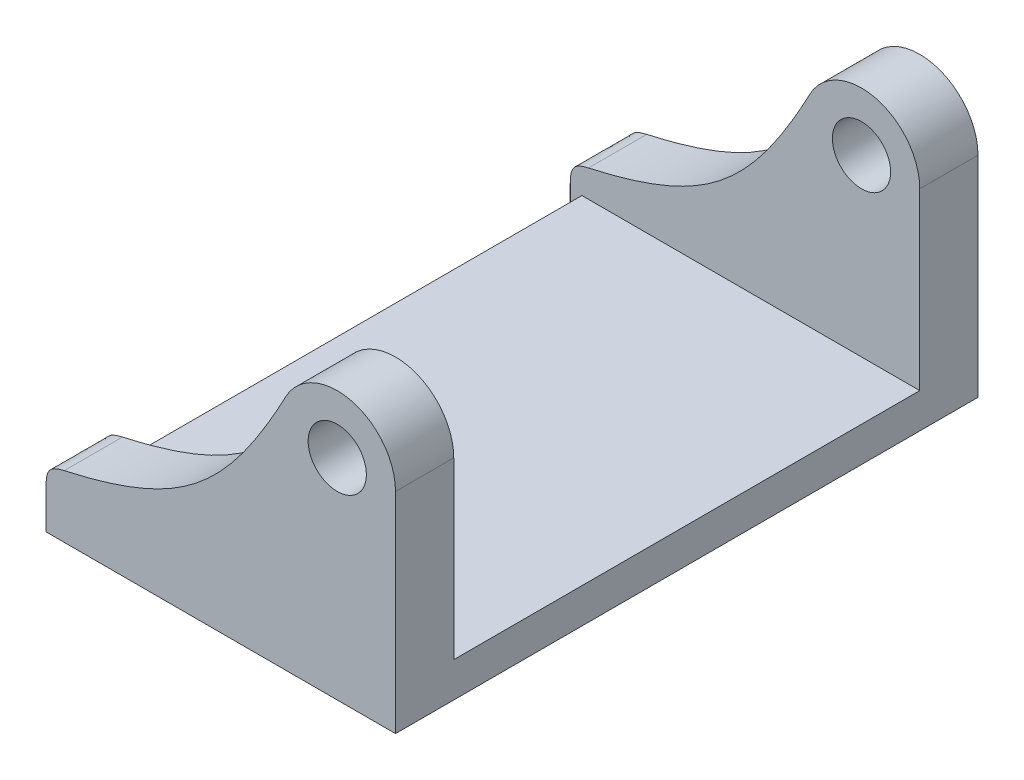
ISO-10303-21;
HEADER;
FILE_DESCRIPTION(('STEP AP214'),'2;1');
FILE_NAME('part.step','',(''),(''),'','','');
FILE_SCHEMA(('AUTOMOTIVE_DESIGN { 1 0 10303 214 1 1 1 1 }'));
ENDSEC;
DATA;
#1=APPLICATION_CONTEXT('core data for automotive mechanical design processes');
#2=APPLICATION_PROTOCOL_DEFINITION('international standard','automotive_design',2000,#1);
#3=PRODUCT_CONTEXT('',#1,'mechanical');
#4=PRODUCT('Part','Part','',(#3));
#5=PRODUCT_RELATED_PRODUCT_CATEGORY('part','',(#4));
#6=PRODUCT_DEFINITION_FORMATION('','',#4);
#7=PRODUCT_DEFINITION_CONTEXT('part definition',#1,'design');
#8=PRODUCT_DEFINITION('design','',#6,#7);
#9=PRODUCT_DEFINITION_SHAPE('','',#8);
#10=(LENGTH_UNIT() NAMED_UNIT(*) SI_UNIT(.MILLI.,.METRE.));
#11=(NAMED_UNIT(*) PLANE_ANGLE_UNIT() SI_UNIT($,.RADIAN.));
#12=(NAMED_UNIT(*) SI_UNIT($,.STERADIAN.) SOLID_ANGLE_UNIT());
#13=UNCERTAINTY_MEASURE_WITH_UNIT(LENGTH_MEASURE(1.E-05),#10,'distance_accuracy_value','');
#14=(GEOMETRIC_REPRESENTATION_CONTEXT(3) GLOBAL_UNCERTAINTY_ASSIGNED_CONTEXT((#13)) GLOBAL_UNIT_ASSIGNED_CONTEXT((#10,
#11,#12)) REPRESENTATION_CONTEXT('',''));
#15=CARTESIAN_POINT('',(0.,0.,0.));
#16=DIRECTION('',(0.,0.,1.));
#17=DIRECTION('',(1.,0.,0.));
#18=AXIS2_PLACEMENT_3D('',#15,#16,#17);
#19=CARTESIAN_POINT('',(0.,3.,0.));
#20=DIRECTION('',(0.,-1.,0.));
#21=DIRECTION('',(0.,0.,-1.));
#22=AXIS2_PLACEMENT_3D('',#19,#20,#21);
#23=PLANE('',#22);
#24=DIRECTION('',(-1.,0.,0.));
#25=VECTOR('',#24,1.);
#26=CARTESIAN_POINT('',(0.,3.,-20.));
#27=LINE('',#26,#25);
#28=CARTESIAN_POINT('',(15.,3.,-20.));
#29=VERTEX_POINT('',#28);
#30=CARTESIAN_POINT('',(-14.,3.,-20.));
#31=VERTEX_POINT('',#30);
#32=EDGE_CURVE('E162',#29,#31,#27,.T.);
#33=ORIENTED_EDGE('',*,*,#32,.T.);
#34=DIRECTION('',(0.,0.,1.));
#35=VECTOR('',#34,1.);
#36=CARTESIAN_POINT('',(-14.,3.,0.));
#37=LINE('',#36,#35);
#38=CARTESIAN_POINT('',(-14.,3.,20.));
#39=VERTEX_POINT('',#38);
#40=EDGE_CURVE('E535',#31,#39,#37,.T.);
#41=ORIENTED_EDGE('',*,*,#40,.T.);
#42=DIRECTION('',(-1.,0.,0.));
#43=VECTOR('',#42,1.);
#44=CARTESIAN_POINT('',(0.,3.,20.));
#45=LINE('',#44,#43);
#46=CARTESIAN_POINT('',(15.,3.,20.));
#47=VERTEX_POINT('',#46);
#48=EDGE_CURVE('E386',#47,#39,#45,.T.);
#49=ORIENTED_EDGE('',*,*,#48,.F.);
#50=DIRECTION('',(0.,0.,-1.));
#51=VECTOR('',#50,1.);
#52=CARTESIAN_POINT('',(15.,3.,25.));
#53=LINE('',#52,#51);
#54=EDGE_CURVE('E387',#47,#29,#53,.T.);
#55=ORIENTED_EDGE('',*,*,#54,.T.);
#56=EDGE_LOOP('',(#33,#41,#49,#55));
#57=FACE_BOUND('',#56,.T.);
#58=ADVANCED_FACE('F41',(#57),#23,.F.);
#59=CARTESIAN_POINT('',(15.,3.,25.));
#60=DIRECTION('',(-1.,0.,0.));
#61=DIRECTION('',(0.,0.,1.));
#62=AXIS2_PLACEMENT_3D('',#59,#60,#61);
#63=PLANE('',#62);
#64=DIRECTION('',(0.,0.,-1.));
#65=VECTOR('',#64,1.);
#66=CARTESIAN_POINT('',(15.,0.,25.));
#67=LINE('',#66,#65);
#68=CARTESIAN_POINT('',(15.,0.,25.));
#69=VERTEX_POINT('',#68);
#70=CARTESIAN_POINT('',(15.,0.,-25.));
#71=VERTEX_POINT('',#70);
#72=EDGE_CURVE('E385',#69,#71,#67,.T.);
#73=ORIENTED_EDGE('',*,*,#72,.T.);
#74=DIRECTION('',(0.,-1.,0.));
#75=VECTOR('',#74,1.);
#76=CARTESIAN_POINT('',(15.,3.,-25.));
#77=LINE('',#76,#75);
#78=CARTESIAN_POINT('',(15.,18.,-25.));
#79=VERTEX_POINT('',#78);
#80=EDGE_CURVE('E144',#79,#71,#77,.T.);
#81=ORIENTED_EDGE('',*,*,#80,.F.);
#82=DIRECTION('',(0.,0.,-1.));
#83=VECTOR('',#82,1.);
#84=CARTESIAN_POINT('',(15.,18.,-20.));
#85=LINE('',#84,#83);
#86=CARTESIAN_POINT('',(15.,18.,-20.));
#87=VERTEX_POINT('',#86);
#88=EDGE_CURVE('E136',#87,#79,#85,.T.);
#89=ORIENTED_EDGE('',*,*,#88,.F.);
#90=DIRECTION('',(0.,-1.,0.));
#91=VECTOR('',#90,1.);
#92=CARTESIAN_POINT('',(15.,0.,-20.));
#93=LINE('',#92,#91);
#94=EDGE_CURVE('E142',#87,#29,#93,.T.);
#95=ORIENTED_EDGE('',*,*,#94,.T.);
#96=ORIENTED_EDGE('',*,*,#54,.F.);
#97=DIRECTION('',(0.,-1.,0.));
#98=VECTOR('',#97,1.);
#99=CARTESIAN_POINT('',(15.,0.,20.));
#100=LINE('',#99,#98);
#101=CARTESIAN_POINT('',(15.,18.,20.));
#102=VERTEX_POINT('',#101);
#103=EDGE_CURVE('E509',#102,#47,#100,.T.);
#104=ORIENTED_EDGE('',*,*,#103,.F.);
#105=DIRECTION('',(0.,0.,1.));
#106=VECTOR('',#105,1.);
#107=CARTESIAN_POINT('',(15.,18.,20.));
#108=LINE('',#107,#106);
#109=CARTESIAN_POINT('',(15.,18.,25.));
#110=VERTEX_POINT('',#109);
#111=EDGE_CURVE('E382',#102,#110,#108,.T.);
#112=ORIENTED_EDGE('',*,*,#111,.T.);
#113=DIRECTION('',(0.,-1.,0.));
#114=VECTOR('',#113,1.);
#115=CARTESIAN_POINT('',(15.,3.,25.));
#116=LINE('',#115,#114);
#117=EDGE_CURVE('E370',#110,#69,#116,.T.);
#118=ORIENTED_EDGE('',*,*,#117,.T.);
#119=EDGE_LOOP('',(#73,#81,#89,#95,#96,#104,#112,#118));
#120=FACE_BOUND('',#119,.T.);
#121=ADVANCED_FACE('F139',(#120),#63,.F.);
#122=CARTESIAN_POINT('',(-15.,3.,-25.));
#123=DIRECTION('',(0.,0.,1.));
#124=DIRECTION('',(1.,0.,0.));
#125=AXIS2_PLACEMENT_3D('',#122,#123,#124);
#126=PLANE('',#125);
#127=DIRECTION('',(0.,-1.,0.));
#128=VECTOR('',#127,1.);
#129=CARTESIAN_POINT('',(-15.,3.,-25.));
#130=LINE('',#129,#128);
#131=CARTESIAN_POINT('',(-15.,3.37956727641906,-25.));
#132=VERTEX_POINT('',#131);
#133=CARTESIAN_POINT('',(-15.,0.,-25.));
#134=VERTEX_POINT('',#133);
#135=EDGE_CURVE('E362',#132,#134,#130,.T.);
#136=ORIENTED_EDGE('',*,*,#135,.F.);
#137=CARTESIAN_POINT('',(-13.4365365637369,5.33134488376153,-25.));
#138=CARTESIAN_POINT('',(-14.9999999999976,4.98165906226673,-25.));
#139=CARTESIAN_POINT('',(-15.,3.37956727641906,-25.));
#140=(BOUNDED_CURVE() B_SPLINE_CURVE(2,(#137,#138,#139),.UNSPECIFIED.,.F.,
.F.) B_SPLINE_CURVE_WITH_KNOTS((3,3),(0.,1.),
.UNSPECIFIED.) CURVE() GEOMETRIC_REPRESENTATION_ITEM() RATIONAL_B_SPLINE_CURVE((1.,1.5,1.)) REPRESENTATION_ITEM(''));
#141=CARTESIAN_POINT('',(-13.4365895277737,5.33157594025399,-25.));
#142=VERTEX_POINT('',#141);
#143=EDGE_CURVE('E407',#132,#142,#140,.F.);
#144=ORIENTED_EDGE('',*,*,#143,.T.);
#145=CARTESIAN_POINT('',(5.58373028161165,20.3444747331644,-25.));
#146=CARTESIAN_POINT('',(-1.07589230968556,7.79979290324144,-25.));
#147=CARTESIAN_POINT('',(-15.,5.,-25.));
#148=(BOUNDED_CURVE() B_SPLINE_CURVE(2,(#145,#146,#147),.UNSPECIFIED.,.F.,
.F.) B_SPLINE_CURVE_WITH_KNOTS((3,3),(0.,1.),
.UNSPECIFIED.) CURVE() GEOMETRIC_REPRESENTATION_ITEM() RATIONAL_B_SPLINE_CURVE((1.,1.5,1.)) REPRESENTATION_ITEM(''));
#149=CARTESIAN_POINT('',(5.58373028161165,20.3444747331644,-25.));
#150=VERTEX_POINT('',#149);
#151=EDGE_CURVE('E602',#142,#150,#148,.F.);
#152=ORIENTED_EDGE('',*,*,#151,.T.);
#153=CARTESIAN_POINT('',(9.99999999999999,18.,-25.));
#154=DIRECTION('',(0.,0.,1.));
#155=DIRECTION('',(1.,0.,0.));
#156=AXIS2_PLACEMENT_3D('',#153,#154,#155);
#157=CIRCLE('',#156,5.);
#158=EDGE_CURVE('E167',#79,#150,#157,.T.);
#159=ORIENTED_EDGE('',*,*,#158,.F.);
#160=ORIENTED_EDGE('',*,*,#80,.T.);
#161=DIRECTION('',(-1.,0.,0.));
#162=VECTOR('',#161,1.);
#163=CARTESIAN_POINT('',(-15.,0.,-25.));
#164=LINE('',#163,#162);
#165=EDGE_CURVE('E391',#71,#134,#164,.T.);
#166=ORIENTED_EDGE('',*,*,#165,.T.);
#167=EDGE_LOOP('',(#136,#144,#152,#159,#160,#166));
#168=FACE_BOUND('',#167,.T.);
#169=CARTESIAN_POINT('',(9.99999999999999,18.,-25.));
#170=DIRECTION('',(0.,0.,1.));
#171=DIRECTION('',(1.,0.,0.));
#172=AXIS2_PLACEMENT_3D('',#169,#170,#171);
#173=CIRCLE('',#172,2.5);
#174=CARTESIAN_POINT('',(12.5,18.,-25.));
#175=VERTEX_POINT('',#174);
#176=EDGE_CURVE('E172',#175,#175,#173,.T.);
#177=ORIENTED_EDGE('',*,*,#176,.T.);
#178=EDGE_LOOP('',(#177));
#179=FACE_BOUND('',#178,.T.);
#180=ADVANCED_FACE('F405',(#168,#179),#126,.F.);
#181=CARTESIAN_POINT('',(-15.,3.,25.));
#182=DIRECTION('',(1.,0.,0.));
#183=DIRECTION('',(0.,0.,-1.));
#184=AXIS2_PLACEMENT_3D('',#181,#182,#183);
#185=PLANE('',#184);
#186=DIRECTION('',(0.,1.,0.));
#187=VECTOR('',#186,1.);
#188=CARTESIAN_POINT('',(-15.,0.,20.));
#189=LINE('',#188,#187);
#190=CARTESIAN_POINT('',(-15.,2.,20.));
#191=VERTEX_POINT('',#190);
#192=CARTESIAN_POINT('',(-15.,3.37956727642001,20.));
#193=VERTEX_POINT('',#192);
#194=EDGE_CURVE('E57',#191,#193,#189,.T.);
#195=ORIENTED_EDGE('',*,*,#194,.F.);
#196=DIRECTION('',(0.,0.,-1.));
#197=VECTOR('',#196,1.);
#198=CARTESIAN_POINT('',(-15.,2.,25.));
#199=LINE('',#198,#197);
#200=CARTESIAN_POINT('',(-15.,2.,-20.));
#201=VERTEX_POINT('',#200);
#202=EDGE_CURVE('E539',#191,#201,#199,.T.);
#203=ORIENTED_EDGE('',*,*,#202,.T.);
#204=DIRECTION('',(0.,1.,0.));
#205=VECTOR('',#204,1.);
#206=CARTESIAN_POINT('',(-15.,0.,-20.));
#207=LINE('',#206,#205);
#208=CARTESIAN_POINT('',(-15.,3.37956727641991,-20.));
#209=VERTEX_POINT('',#208);
#210=EDGE_CURVE('E64',#201,#209,#207,.T.);
#211=ORIENTED_EDGE('',*,*,#210,.T.);
#212=CARTESIAN_POINT('',(-15.,3.37956727641975,-25.25));
#213=CARTESIAN_POINT('',(-15.,3.37956727641418,-23.4166666666666));
#214=CARTESIAN_POINT('',(-15.,3.37956727642134,-21.5833333333334));
#215=CARTESIAN_POINT('',(-15.,3.37956727641975,-19.75));
#216=(BOUNDED_CURVE() B_SPLINE_CURVE(3,(#212,#213,#214,#215),.UNSPECIFIED.,.F.,
.F.) B_SPLINE_CURVE_WITH_KNOTS((4,4),(-0.00275,0.00275000000000001),
.UNSPECIFIED.) CURVE() GEOMETRIC_REPRESENTATION_ITEM() RATIONAL_B_SPLINE_CURVE((1.,1.,1.,1.)) REPRESENTATION_ITEM(''));
#217=EDGE_CURVE('E413',#209,#132,#216,.F.);
#218=ORIENTED_EDGE('',*,*,#217,.T.);
#219=ORIENTED_EDGE('',*,*,#135,.T.);
#220=DIRECTION('',(0.,0.,1.));
#221=VECTOR('',#220,1.);
#222=CARTESIAN_POINT('',(-15.,0.,25.));
#223=LINE('',#222,#221);
#224=CARTESIAN_POINT('',(-15.,0.,25.));
#225=VERTEX_POINT('',#224);
#226=EDGE_CURVE('E393',#134,#225,#223,.T.);
#227=ORIENTED_EDGE('',*,*,#226,.T.);
#228=DIRECTION('',(0.,-1.,0.));
#229=VECTOR('',#228,1.);
#230=CARTESIAN_POINT('',(-15.,3.,25.));
#231=LINE('',#230,#229);
#232=CARTESIAN_POINT('',(-15.,3.37956727641917,25.));
#233=VERTEX_POINT('',#232);
#234=EDGE_CURVE('E366',#233,#225,#231,.T.);
#235=ORIENTED_EDGE('',*,*,#234,.F.);
#236=CARTESIAN_POINT('',(-15.,3.37956727641975,19.75));
#237=CARTESIAN_POINT('',(-15.,3.37956727642213,21.5833333333333));
#238=CARTESIAN_POINT('',(-15.,3.37956727641498,23.4166666666667));
#239=CARTESIAN_POINT('',(-15.,3.37956727641975,25.25));
#240=(BOUNDED_CURVE() B_SPLINE_CURVE(3,(#236,#237,#238,#239),.UNSPECIFIED.,.F.,
.F.) B_SPLINE_CURVE_WITH_KNOTS((4,4),(-0.00275000000000001,0.00275),
.UNSPECIFIED.) CURVE() GEOMETRIC_REPRESENTATION_ITEM() RATIONAL_B_SPLINE_CURVE((1.,1.,1.,1.)) REPRESENTATION_ITEM(''));
#241=EDGE_CURVE('E337',#233,#193,#240,.F.);
#242=ORIENTED_EDGE('',*,*,#241,.T.);
#243=EDGE_LOOP('',(#195,#203,#211,#218,#219,#227,#235,#242));
#244=FACE_BOUND('',#243,.T.);
#245=ADVANCED_FACE('F411',(#244),#185,.F.);
#246=CARTESIAN_POINT('',(-15.,3.,25.));
#247=DIRECTION('',(0.,0.,-1.));
#248=DIRECTION('',(-1.,0.,0.));
#249=AXIS2_PLACEMENT_3D('',#246,#247,#248);
#250=PLANE('',#249);
#251=CARTESIAN_POINT('',(-15.,5.,25.));
#252=CARTESIAN_POINT('',(-1.07589230968556,7.79979290324144,25.));
#253=CARTESIAN_POINT('',(5.58373028161165,20.3444747331644,25.));
#254=(BOUNDED_CURVE() B_SPLINE_CURVE(2,(#251,#252,#253),.UNSPECIFIED.,.F.,
.F.) B_SPLINE_CURVE_WITH_KNOTS((3,3),(0.,1.),
.UNSPECIFIED.) CURVE() GEOMETRIC_REPRESENTATION_ITEM() RATIONAL_B_SPLINE_CURVE((1.,1.5,1.)) REPRESENTATION_ITEM(''));
#255=CARTESIAN_POINT('',(5.58373028161165,20.3444747331644,25.));
#256=VERTEX_POINT('',#255);
#257=CARTESIAN_POINT('',(-13.436589843573,5.33158144430278,25.));
#258=VERTEX_POINT('',#257);
#259=EDGE_CURVE('E349',#256,#258,#254,.F.);
#260=ORIENTED_EDGE('',*,*,#259,.T.);
#261=CARTESIAN_POINT('',(-15.,3.37956727641917,25.));
#262=CARTESIAN_POINT('',(-14.9999999999982,4.98165906226797,25.));
#263=CARTESIAN_POINT('',(-13.4365365637371,5.33134488376148,25.));
#264=(BOUNDED_CURVE() B_SPLINE_CURVE(2,(#261,#262,#263),.UNSPECIFIED.,.F.,
.F.) B_SPLINE_CURVE_WITH_KNOTS((3,3),(0.,1.),
.UNSPECIFIED.) CURVE() GEOMETRIC_REPRESENTATION_ITEM() RATIONAL_B_SPLINE_CURVE((1.,1.5,1.)) REPRESENTATION_ITEM(''));
#265=EDGE_CURVE('E230',#258,#233,#264,.F.);
#266=ORIENTED_EDGE('',*,*,#265,.T.);
#267=ORIENTED_EDGE('',*,*,#234,.T.);
#268=DIRECTION('',(1.,0.,0.));
#269=VECTOR('',#268,1.);
#270=CARTESIAN_POINT('',(-15.,0.,25.));
#271=LINE('',#270,#269);
#272=EDGE_CURVE('E389',#225,#69,#271,.T.);
#273=ORIENTED_EDGE('',*,*,#272,.T.);
#274=ORIENTED_EDGE('',*,*,#117,.F.);
#275=CARTESIAN_POINT('',(9.99999999999999,18.,25.));
#276=DIRECTION('',(0.,0.,1.));
#277=DIRECTION('',(1.,0.,0.));
#278=AXIS2_PLACEMENT_3D('',#275,#276,#277);
#279=CIRCLE('',#278,5.);
#280=EDGE_CURVE('E372',#110,#256,#279,.T.);
#281=ORIENTED_EDGE('',*,*,#280,.T.);
#282=EDGE_LOOP('',(#260,#266,#267,#273,#274,#281));
#283=FACE_BOUND('',#282,.T.);
#284=CARTESIAN_POINT('',(9.99999999999999,18.,25.));
#285=DIRECTION('',(0.,0.,1.));
#286=DIRECTION('',(1.,0.,0.));
#287=AXIS2_PLACEMENT_3D('',#284,#285,#286);
#288=CIRCLE('',#287,2.5);
#289=CARTESIAN_POINT('',(12.5,18.,25.));
#290=VERTEX_POINT('',#289);
#291=EDGE_CURVE('E148',#290,#290,#288,.T.);
#292=ORIENTED_EDGE('',*,*,#291,.F.);
#293=EDGE_LOOP('',(#292));
#294=FACE_BOUND('',#293,.T.);
#295=ADVANCED_FACE('F397',(#283,#294),#250,.F.);
#296=CARTESIAN_POINT('',(0.,0.,0.));
#297=DIRECTION('',(0.,-1.,0.));
#298=DIRECTION('',(0.,0.,-1.));
#299=AXIS2_PLACEMENT_3D('',#296,#297,#298);
#300=PLANE('',#299);
#301=ORIENTED_EDGE('',*,*,#72,.F.);
#302=ORIENTED_EDGE('',*,*,#272,.F.);
#303=ORIENTED_EDGE('',*,*,#226,.F.);
#304=ORIENTED_EDGE('',*,*,#165,.F.);
#305=EDGE_LOOP('',(#301,#302,#303,#304));
#306=FACE_BOUND('',#305,.T.);
#307=ADVANCED_FACE('F403',(#306),#300,.T.);
#308=CARTESIAN_POINT('',(9.99999999999999,18.,20.));
#309=DIRECTION('',(0.,0.,1.));
#310=DIRECTION('',(1.,0.,0.));
#311=AXIS2_PLACEMENT_3D('',#308,#309,#310);
#312=CYLINDRICAL_SURFACE('',#311,2.5);
#313=CARTESIAN_POINT('',(9.99999999999999,18.,20.));
#314=DIRECTION('',(0.,0.,1.));
#315=DIRECTION('',(1.,0.,0.));
#316=AXIS2_PLACEMENT_3D('',#313,#314,#315);
#317=CIRCLE('',#316,2.5);
#318=CARTESIAN_POINT('',(12.5,18.,20.));
#319=VERTEX_POINT('',#318);
#320=EDGE_CURVE('E375',#319,#319,#317,.T.);
#321=ORIENTED_EDGE('',*,*,#320,.F.);
#322=EDGE_LOOP('',(#321));
#323=FACE_BOUND('',#322,.T.);
#324=ORIENTED_EDGE('',*,*,#291,.T.);
#325=EDGE_LOOP('',(#324));
#326=FACE_BOUND('',#325,.T.);
#327=ADVANCED_FACE('F518',(#323,#326),#312,.F.);
#328=CARTESIAN_POINT('',(9.99999999999999,18.,20.));
#329=DIRECTION('',(0.,0.,1.));
#330=DIRECTION('',(1.,0.,0.));
#331=AXIS2_PLACEMENT_3D('',#328,#329,#330);
#332=CYLINDRICAL_SURFACE('',#331,5.);
#333=CARTESIAN_POINT('',(9.99999999999999,18.,20.));
#334=DIRECTION('',(0.,0.,1.));
#335=DIRECTION('',(1.,0.,0.));
#336=AXIS2_PLACEMENT_3D('',#333,#334,#335);
#337=CIRCLE('',#336,5.);
#338=CARTESIAN_POINT('',(5.58373028161166,20.3444747331644,20.));
#339=VERTEX_POINT('',#338);
#340=EDGE_CURVE('E376',#102,#339,#337,.T.);
#341=ORIENTED_EDGE('',*,*,#340,.T.);
#342=CARTESIAN_POINT('',(5.58373028161165,20.3444747331644,25.25));
#343=CARTESIAN_POINT('',(5.58373028161165,20.3444747331644,23.4166666666667));
#344=CARTESIAN_POINT('',(5.58373028161165,20.3444747331644,21.5833333333333));
#345=CARTESIAN_POINT('',(5.58373028161165,20.3444747331644,19.75));
#346=(BOUNDED_CURVE() B_SPLINE_CURVE(3,(#342,#343,#344,#345),.UNSPECIFIED.,.F.,
.F.) B_SPLINE_CURVE_WITH_KNOTS((4,4),(-0.00525,0.00025),
.UNSPECIFIED.) CURVE() GEOMETRIC_REPRESENTATION_ITEM() RATIONAL_B_SPLINE_CURVE((1.,1.,1.,1.)) REPRESENTATION_ITEM(''));
#347=EDGE_CURVE('E354',#339,#256,#346,.F.);
#348=ORIENTED_EDGE('',*,*,#347,.T.);
#349=ORIENTED_EDGE('',*,*,#280,.F.);
#350=ORIENTED_EDGE('',*,*,#111,.F.);
#351=EDGE_LOOP('',(#341,#348,#349,#350));
#352=FACE_BOUND('',#351,.T.);
#353=ADVANCED_FACE('F205',(#352),#332,.T.);
#354=CARTESIAN_POINT('',(0.,0.,20.));
#355=DIRECTION('',(0.,0.,1.));
#356=DIRECTION('',(1.,0.,0.));
#357=AXIS2_PLACEMENT_3D('',#354,#355,#356);
#358=PLANE('',#357);
#359=ORIENTED_EDGE('',*,*,#320,.T.);
#360=EDGE_LOOP('',(#359));
#361=FACE_BOUND('',#360,.T.);
#362=ORIENTED_EDGE('',*,*,#194,.T.);
#363=CARTESIAN_POINT('',(-13.436536563739,5.33134488376105,20.));
#364=CARTESIAN_POINT('',(-15.0000000000027,4.981659062269,20.));
#365=CARTESIAN_POINT('',(-15.,3.37956727642001,20.));
#366=(BOUNDED_CURVE() B_SPLINE_CURVE(2,(#363,#364,#365),.UNSPECIFIED.,.F.,
.F.) B_SPLINE_CURVE_WITH_KNOTS((3,3),(0.,1.),
.UNSPECIFIED.) CURVE() GEOMETRIC_REPRESENTATION_ITEM() RATIONAL_B_SPLINE_CURVE((1.,1.5,1.)) REPRESENTATION_ITEM(''));
#367=CARTESIAN_POINT('',(-13.4365886394232,5.33157613916213,20.));
#368=VERTEX_POINT('',#367);
#369=EDGE_CURVE('E338',#193,#368,#366,.F.);
#370=ORIENTED_EDGE('',*,*,#369,.T.);
#371=CARTESIAN_POINT('',(5.58373028161165,20.3444747331644,20.));
#372=CARTESIAN_POINT('',(-1.07589230968556,7.79979290324144,20.));
#373=CARTESIAN_POINT('',(-15.,5.,20.));
#374=(BOUNDED_CURVE() B_SPLINE_CURVE(2,(#371,#372,#373),.UNSPECIFIED.,.F.,
.F.) B_SPLINE_CURVE_WITH_KNOTS((3,3),(0.,1.),
.UNSPECIFIED.) CURVE() GEOMETRIC_REPRESENTATION_ITEM() RATIONAL_B_SPLINE_CURVE((1.,1.5,1.)) REPRESENTATION_ITEM(''));
#375=EDGE_CURVE('E345',#368,#339,#374,.F.);
#376=ORIENTED_EDGE('',*,*,#375,.T.);
#377=ORIENTED_EDGE('',*,*,#340,.F.);
#378=ORIENTED_EDGE('',*,*,#103,.T.);
#379=ORIENTED_EDGE('',*,*,#48,.T.);
#380=DIRECTION('',(0.707106781186547,0.707106781186548,0.));
#381=VECTOR('',#380,1.);
#382=CARTESIAN_POINT('',(-8.50000000000001,8.5,20.));
#383=LINE('',#382,#381);
#384=EDGE_CURVE('E50',#39,#191,#383,.F.);
#385=ORIENTED_EDGE('',*,*,#384,.T.);
#386=EDGE_LOOP('',(#362,#370,#376,#377,#378,#379,#385));
#387=FACE_BOUND('',#386,.T.);
#388=ADVANCED_FACE('F200',(#361,#387),#358,.F.);
#389=CARTESIAN_POINT('',(-15.,5.,25.25));
#390=CARTESIAN_POINT('',(-15.,5.,23.4166666666667));
#391=CARTESIAN_POINT('',(-15.,5.,21.5833333333333));
#392=CARTESIAN_POINT('',(-15.,5.,19.75));
#393=CARTESIAN_POINT('',(-1.07589230968556,7.79979290324144,25.25));
#394=CARTESIAN_POINT('',(-1.07589230968556,7.79979290324144,23.4166666666667));
#395=CARTESIAN_POINT('',(-1.07589230968556,7.79979290324144,21.5833333333333));
#396=CARTESIAN_POINT('',(-1.07589230968556,7.79979290324144,19.75));
#397=CARTESIAN_POINT('',(5.58373028161165,20.3444747331644,25.25));
#398=CARTESIAN_POINT('',(5.58373028161165,20.3444747331644,23.4166666666667));
#399=CARTESIAN_POINT('',(5.58373028161165,20.3444747331644,21.5833333333333));
#400=CARTESIAN_POINT('',(5.58373028161165,20.3444747331644,19.75));
#401=(BOUNDED_SURFACE() B_SPLINE_SURFACE(2,3,((#389,#390,#391,#392),(#393,#394,#395,#396),(#397,
#398,#399,#400)),.UNSPECIFIED.,.F.,.F.,.F.) B_SPLINE_SURFACE_WITH_KNOTS((3,3),(4,4),(0.,1.),
(-0.00525,0.00025),
.UNSPECIFIED.) GEOMETRIC_REPRESENTATION_ITEM() RATIONAL_B_SPLINE_SURFACE(((1.,1.,1.,1.),(1.5,
1.5,1.5,1.5),(1.,1.,1.,1.))) REPRESENTATION_ITEM('') SURFACE());
#402=CARTESIAN_POINT('',(-13.436536563739,5.33134488376105,19.75));
#403=CARTESIAN_POINT('',(-13.436536563739,5.33134488376105,21.5833333333333));
#404=CARTESIAN_POINT('',(-13.436536563739,5.33134488376105,23.4166666666667));
#405=CARTESIAN_POINT('',(-13.436536563739,5.33134488376105,25.25));
#406=(BOUNDED_CURVE() B_SPLINE_CURVE(3,(#402,#403,#404,#405),.UNSPECIFIED.,.F.,
.F.) B_SPLINE_CURVE_WITH_KNOTS((4,4),(-0.00525,0.00025),
.UNSPECIFIED.) CURVE() GEOMETRIC_REPRESENTATION_ITEM() RATIONAL_B_SPLINE_CURVE((1.03807871736871,
1.03807871736871,1.03807871736871,1.03807871736871)) REPRESENTATION_ITEM(''));
#407=EDGE_CURVE('E341',#368,#258,#406,.T.);
#408=ORIENTED_EDGE('',*,*,#375,.F.);
#409=ORIENTED_EDGE('',*,*,#407,.T.);
#410=ORIENTED_EDGE('',*,*,#259,.F.);
#411=ORIENTED_EDGE('',*,*,#347,.F.);
#412=EDGE_LOOP('',(#408,#409,#410,#411));
#413=FACE_BOUND('',#412,.T.);
#414=ADVANCED_FACE('F204',(#413),#401,.T.);
#415=CARTESIAN_POINT('',(-15.,3.37956727641975,25.25));
#416=CARTESIAN_POINT('',(-15.,3.37956727641498,23.4166666666667));
#417=CARTESIAN_POINT('',(-15.,3.37956727642213,21.5833333333333));
#418=CARTESIAN_POINT('',(-15.,3.37956727641975,19.75));
#419=CARTESIAN_POINT('',(-15.,4.98165906226791,25.25));
#420=CARTESIAN_POINT('',(-14.9999999999841,4.98165906226791,23.4166666666667));
#421=CARTESIAN_POINT('',(-15.0000000000223,4.98165906227666,21.5833333333333));
#422=CARTESIAN_POINT('',(-15.,4.98165906226791,19.75));
#423=CARTESIAN_POINT('',(-13.4365365637378,5.33134488376131,25.25));
#424=CARTESIAN_POINT('',(-13.4365365637313,5.33134488376278,23.4166666666667));
#425=CARTESIAN_POINT('',(-13.4365365637474,5.33134488375916,21.5833333333333));
#426=CARTESIAN_POINT('',(-13.4365365637378,5.33134488376131,19.75));
#427=(BOUNDED_SURFACE() B_SPLINE_SURFACE(2,3,((#415,#416,#417,#418),(#419,#420,#421,#422),(#423,
#424,#425,#426)),.UNSPECIFIED.,.F.,.F.,.F.) B_SPLINE_SURFACE_WITH_KNOTS((3,3),(4,4),(0.,1.),
(-0.00275000000000001,0.00275),
.UNSPECIFIED.) GEOMETRIC_REPRESENTATION_ITEM() RATIONAL_B_SPLINE_SURFACE(((1.,1.,1.,1.),(1.5,
1.5,1.5,1.5),(1.,1.,1.,1.))) REPRESENTATION_ITEM('') SURFACE());
#428=ORIENTED_EDGE('',*,*,#369,.F.);
#429=ORIENTED_EDGE('',*,*,#241,.F.);
#430=ORIENTED_EDGE('',*,*,#265,.F.);
#431=ORIENTED_EDGE('',*,*,#407,.F.);
#432=EDGE_LOOP('',(#428,#429,#430,#431));
#433=FACE_BOUND('',#432,.T.);
#434=ADVANCED_FACE('F195',(#433),#427,.T.);
#435=CARTESIAN_POINT('',(9.99999999999999,18.,-20.));
#436=DIRECTION('',(0.,0.,-1.));
#437=DIRECTION('',(-1.,0.,0.));
#438=AXIS2_PLACEMENT_3D('',#435,#436,#437);
#439=CYLINDRICAL_SURFACE('',#438,5.);
#440=ORIENTED_EDGE('',*,*,#158,.T.);
#441=CARTESIAN_POINT('',(5.58373028161165,20.3444747331644,-19.75));
#442=CARTESIAN_POINT('',(5.58373028161165,20.3444747331644,-21.5833333333333));
#443=CARTESIAN_POINT('',(5.58373028161165,20.3444747331644,-23.4166666666667));
#444=CARTESIAN_POINT('',(5.58373028161165,20.3444747331644,-25.25));
#445=(BOUNDED_CURVE() B_SPLINE_CURVE(3,(#441,#442,#443,#444),.UNSPECIFIED.,.F.,
.F.) B_SPLINE_CURVE_WITH_KNOTS((4,4),(-0.00525,0.00025),
.UNSPECIFIED.) CURVE() GEOMETRIC_REPRESENTATION_ITEM() RATIONAL_B_SPLINE_CURVE((1.,1.,1.,1.)) REPRESENTATION_ITEM(''));
#446=CARTESIAN_POINT('',(5.58373028161166,20.3444747331644,-20.));
#447=VERTEX_POINT('',#446);
#448=EDGE_CURVE('E154',#150,#447,#445,.F.);
#449=ORIENTED_EDGE('',*,*,#448,.T.);
#450=CARTESIAN_POINT('',(9.99999999999999,18.,-20.));
#451=DIRECTION('',(0.,0.,1.));
#452=DIRECTION('',(1.,0.,0.));
#453=AXIS2_PLACEMENT_3D('',#450,#451,#452);
#454=CIRCLE('',#453,5.);
#455=EDGE_CURVE('E149',#87,#447,#454,.T.);
#456=ORIENTED_EDGE('',*,*,#455,.F.);
#457=ORIENTED_EDGE('',*,*,#88,.T.);
#458=EDGE_LOOP('',(#440,#449,#456,#457));
#459=FACE_BOUND('',#458,.T.);
#460=ADVANCED_FACE('F152',(#459),#439,.T.);
#461=CARTESIAN_POINT('',(9.99999999999999,18.,-20.));
#462=DIRECTION('',(0.,0.,-1.));
#463=DIRECTION('',(-1.,0.,0.));
#464=AXIS2_PLACEMENT_3D('',#461,#462,#463);
#465=CYLINDRICAL_SURFACE('',#464,2.5);
#466=CARTESIAN_POINT('',(9.99999999999999,18.,-20.));
#467=DIRECTION('',(0.,0.,1.));
#468=DIRECTION('',(1.,0.,0.));
#469=AXIS2_PLACEMENT_3D('',#466,#467,#468);
#470=CIRCLE('',#469,2.5);
#471=CARTESIAN_POINT('',(12.5,18.,-20.));
#472=VERTEX_POINT('',#471);
#473=EDGE_CURVE('E163',#472,#472,#470,.T.);
#474=ORIENTED_EDGE('',*,*,#473,.T.);
#475=EDGE_LOOP('',(#474));
#476=FACE_BOUND('',#475,.T.);
#477=ORIENTED_EDGE('',*,*,#176,.F.);
#478=EDGE_LOOP('',(#477));
#479=FACE_BOUND('',#478,.T.);
#480=ADVANCED_FACE('F194',(#476,#479),#465,.F.);
#481=CARTESIAN_POINT('',(0.,0.,-20.));
#482=DIRECTION('',(0.,0.,-1.));
#483=DIRECTION('',(1.,0.,0.));
#484=AXIS2_PLACEMENT_3D('',#481,#482,#483);
#485=PLANE('',#484);
#486=ORIENTED_EDGE('',*,*,#473,.F.);
#487=EDGE_LOOP('',(#486));
#488=FACE_BOUND('',#487,.T.);
#489=CARTESIAN_POINT('',(-15.,5.,-20.));
#490=CARTESIAN_POINT('',(-1.07589230968556,7.79979290324144,-20.));
#491=CARTESIAN_POINT('',(5.58373028161165,20.3444747331644,-20.));
#492=(BOUNDED_CURVE() B_SPLINE_CURVE(2,(#489,#490,#491),.UNSPECIFIED.,.F.,
.F.) B_SPLINE_CURVE_WITH_KNOTS((3,3),(0.,1.),
.UNSPECIFIED.) CURVE() GEOMETRIC_REPRESENTATION_ITEM() RATIONAL_B_SPLINE_CURVE((1.,1.5,1.)) REPRESENTATION_ITEM(''));
#493=CARTESIAN_POINT('',(-13.4365898435737,5.33158144430262,-20.));
#494=VERTEX_POINT('',#493);
#495=EDGE_CURVE('E418',#447,#494,#492,.F.);
#496=ORIENTED_EDGE('',*,*,#495,.T.);
#497=CARTESIAN_POINT('',(-15.,3.37956727641991,-20.));
#498=CARTESIAN_POINT('',(-14.9999999999999,4.98165906226786,-20.));
#499=CARTESIAN_POINT('',(-13.4365365637378,5.33134488376132,-20.));
#500=(BOUNDED_CURVE() B_SPLINE_CURVE(2,(#497,#498,#499),.UNSPECIFIED.,.F.,
.F.) B_SPLINE_CURVE_WITH_KNOTS((3,3),(0.,1.),
.UNSPECIFIED.) CURVE() GEOMETRIC_REPRESENTATION_ITEM() RATIONAL_B_SPLINE_CURVE((1.,1.5,1.)) REPRESENTATION_ITEM(''));
#501=EDGE_CURVE('E540',#494,#209,#500,.F.);
#502=ORIENTED_EDGE('',*,*,#501,.T.);
#503=ORIENTED_EDGE('',*,*,#210,.F.);
#504=DIRECTION('',(-0.707106781186547,-0.707106781186548,0.));
#505=VECTOR('',#504,1.);
#506=CARTESIAN_POINT('',(-8.50000000000001,8.5,-20.));
#507=LINE('',#506,#505);
#508=EDGE_CURVE('E13',#201,#31,#507,.F.);
#509=ORIENTED_EDGE('',*,*,#508,.T.);
#510=ORIENTED_EDGE('',*,*,#32,.F.);
#511=ORIENTED_EDGE('',*,*,#94,.F.);
#512=ORIENTED_EDGE('',*,*,#455,.T.);
#513=EDGE_LOOP('',(#496,#502,#503,#509,#510,#511,#512));
#514=FACE_BOUND('',#513,.T.);
#515=ADVANCED_FACE('F160',(#488,#514),#485,.F.);
#516=CARTESIAN_POINT('',(5.58373028161165,20.3444747331644,-25.25));
#517=CARTESIAN_POINT('',(5.58373028161165,20.3444747331644,-23.4166666666667));
#518=CARTESIAN_POINT('',(5.58373028161165,20.3444747331644,-21.5833333333333));
#519=CARTESIAN_POINT('',(5.58373028161165,20.3444747331644,-19.75));
#520=CARTESIAN_POINT('',(-1.07589230968556,7.79979290324144,-25.25));
#521=CARTESIAN_POINT('',(-1.07589230968556,7.79979290324144,-23.4166666666667));
#522=CARTESIAN_POINT('',(-1.07589230968556,7.79979290324144,-21.5833333333333));
#523=CARTESIAN_POINT('',(-1.07589230968556,7.79979290324144,-19.75));
#524=CARTESIAN_POINT('',(-15.,5.,-25.25));
#525=CARTESIAN_POINT('',(-15.,5.,-23.4166666666667));
#526=CARTESIAN_POINT('',(-15.,5.,-21.5833333333333));
#527=CARTESIAN_POINT('',(-15.,5.,-19.75));
#528=(BOUNDED_SURFACE() B_SPLINE_SURFACE(2,3,((#516,#517,#518,#519),(#520,#521,#522,#523),(#524,
#525,#526,#527)),.UNSPECIFIED.,.F.,.F.,.F.) B_SPLINE_SURFACE_WITH_KNOTS((3,3),(4,4),(0.,1.),
(-0.00525,0.00025),
.UNSPECIFIED.) GEOMETRIC_REPRESENTATION_ITEM() RATIONAL_B_SPLINE_SURFACE(((1.,1.,1.,1.),(1.5,
1.5,1.5,1.5),(1.,1.,1.,1.))) REPRESENTATION_ITEM('') SURFACE());
#529=CARTESIAN_POINT('',(-13.4365365637369,5.33134488376153,-25.25));
#530=CARTESIAN_POINT('',(-13.4365365637369,5.33134488376153,-23.4166666666667));
#531=CARTESIAN_POINT('',(-13.4365365637369,5.33134488376153,-21.5833333333333));
#532=CARTESIAN_POINT('',(-13.4365365637369,5.33134488376153,-19.75));
#533=(BOUNDED_CURVE() B_SPLINE_CURVE(3,(#529,#530,#531,#532),.UNSPECIFIED.,.F.,
.F.) B_SPLINE_CURVE_WITH_KNOTS((4,4),(-0.00525,0.00025),
.UNSPECIFIED.) CURVE() GEOMETRIC_REPRESENTATION_ITEM() RATIONAL_B_SPLINE_CURVE((1.03807871736876,
1.03807871736876,1.03807871736876,1.03807871736876)) REPRESENTATION_ITEM(''));
#534=EDGE_CURVE('E543',#142,#494,#533,.T.);
#535=ORIENTED_EDGE('',*,*,#151,.F.);
#536=ORIENTED_EDGE('',*,*,#534,.T.);
#537=ORIENTED_EDGE('',*,*,#495,.F.);
#538=ORIENTED_EDGE('',*,*,#448,.F.);
#539=EDGE_LOOP('',(#535,#536,#537,#538));
#540=FACE_BOUND('',#539,.T.);
#541=ADVANCED_FACE('F257',(#540),#528,.T.);
#542=CARTESIAN_POINT('',(-13.4365365637378,5.33134488376131,-25.25));
#543=CARTESIAN_POINT('',(-13.4365365637299,5.33134488376308,-23.4166666666667));
#544=CARTESIAN_POINT('',(-13.4365365637378,5.33134488376131,-21.5833333333333));
#545=CARTESIAN_POINT('',(-13.4365365637378,5.33134488376131,-19.75));
#546=CARTESIAN_POINT('',(-15.,4.98165906226792,-25.25));
#547=CARTESIAN_POINT('',(-14.9999999999809,4.98165906225837,-23.4166666666667));
#548=CARTESIAN_POINT('',(-15.,4.98165906226792,-21.5833333333333));
#549=CARTESIAN_POINT('',(-15.,4.98165906226792,-19.75));
#550=CARTESIAN_POINT('',(-15.,3.37956727641975,-25.25));
#551=CARTESIAN_POINT('',(-15.,3.37956727641418,-23.4166666666666));
#552=CARTESIAN_POINT('',(-15.,3.37956727642134,-21.5833333333334));
#553=CARTESIAN_POINT('',(-15.,3.37956727641975,-19.75));
#554=(BOUNDED_SURFACE() B_SPLINE_SURFACE(2,3,((#542,#543,#544,#545),(#546,#547,#548,#549),(#550,
#551,#552,#553)),.UNSPECIFIED.,.F.,.F.,.F.) B_SPLINE_SURFACE_WITH_KNOTS((3,3),(4,4),(0.,1.),
(-0.00275,0.00275000000000001),
.UNSPECIFIED.) GEOMETRIC_REPRESENTATION_ITEM() RATIONAL_B_SPLINE_SURFACE(((1.,1.,1.,1.),(1.5,
1.5,1.5,1.5),(1.,1.,1.,1.))) REPRESENTATION_ITEM('') SURFACE());
#555=ORIENTED_EDGE('',*,*,#501,.F.);
#556=ORIENTED_EDGE('',*,*,#534,.F.);
#557=ORIENTED_EDGE('',*,*,#143,.F.);
#558=ORIENTED_EDGE('',*,*,#217,.F.);
#559=EDGE_LOOP('',(#555,#556,#557,#558));
#560=FACE_BOUND('',#559,.T.);
#561=ADVANCED_FACE('F551',(#560),#554,.T.);
#562=CARTESIAN_POINT('',(-14.,3.,0.));
#563=DIRECTION('',(0.707106781186548,-0.707106781186547,0.));
#564=DIRECTION('',(0.,0.,1.));
#565=AXIS2_PLACEMENT_3D('',#562,#563,#564);
#566=PLANE('',#565);
#567=ORIENTED_EDGE('',*,*,#508,.F.);
#568=ORIENTED_EDGE('',*,*,#202,.F.);
#569=ORIENTED_EDGE('',*,*,#384,.F.);
#570=ORIENTED_EDGE('',*,*,#40,.F.);
#571=EDGE_LOOP('',(#567,#568,#569,#570));
#572=FACE_BOUND('',#571,.T.);
#573=ADVANCED_FACE('F44',(#572),#566,.F.);
#574=CLOSED_SHELL('',(#58,#121,#180,#245,#295,#307,#327,#353,#388,#414,#434,#460,#480,#515,#541,
#561,#573));
#575=MANIFOLD_SOLID_BREP('B2',#574);
#576=ADVANCED_BREP_SHAPE_REPRESENTATION('',(#18,#575),#14);
#577=SHAPE_DEFINITION_REPRESENTATION(#9,#576);
ENDSEC;
END-ISO-10303-21;
